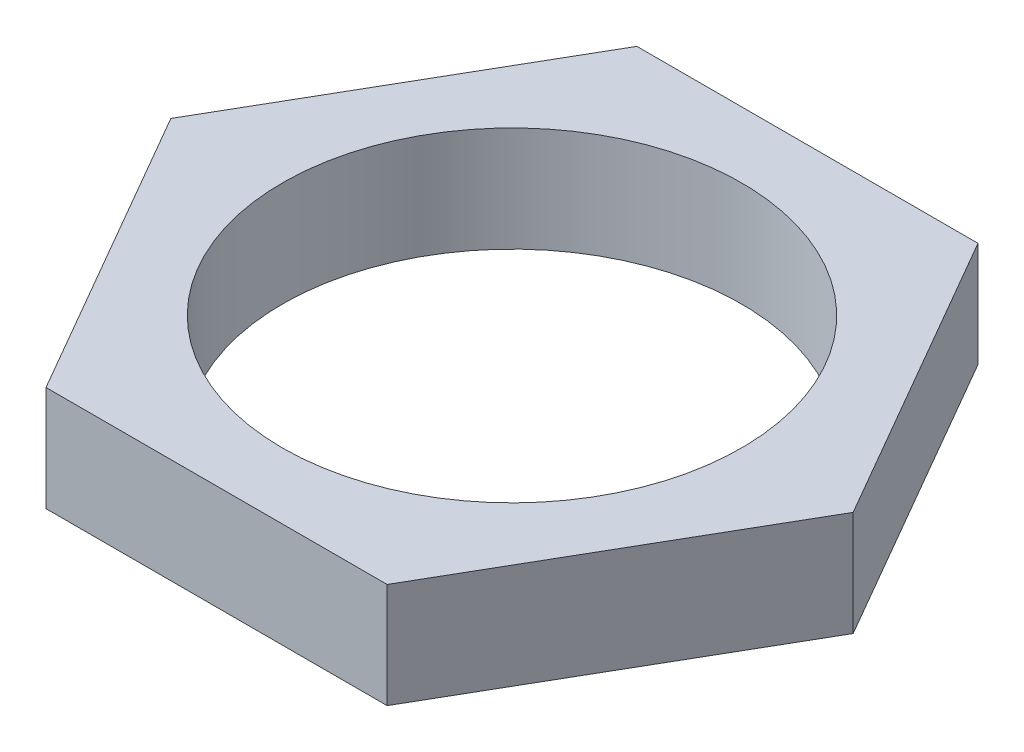
ISO-10303-21;
HEADER;
FILE_DESCRIPTION(('STEP AP214'),'2;1');
FILE_NAME('part.step','',(''),(''),'','','');
FILE_SCHEMA(('AUTOMOTIVE_DESIGN { 1 0 10303 214 1 1 1 1 }'));
ENDSEC;
DATA;
#1=APPLICATION_CONTEXT('core data for automotive mechanical design processes');
#2=APPLICATION_PROTOCOL_DEFINITION('international standard','automotive_design',2000,#1);
#3=PRODUCT_CONTEXT('',#1,'mechanical');
#4=PRODUCT('Part','Part','',(#3));
#5=PRODUCT_RELATED_PRODUCT_CATEGORY('part','',(#4));
#6=PRODUCT_DEFINITION_FORMATION('','',#4);
#7=PRODUCT_DEFINITION_CONTEXT('part definition',#1,'design');
#8=PRODUCT_DEFINITION('design','',#6,#7);
#9=PRODUCT_DEFINITION_SHAPE('','',#8);
#10=(LENGTH_UNIT() NAMED_UNIT(*) SI_UNIT(.MILLI.,.METRE.));
#11=(NAMED_UNIT(*) PLANE_ANGLE_UNIT() SI_UNIT($,.RADIAN.));
#12=(NAMED_UNIT(*) SI_UNIT($,.STERADIAN.) SOLID_ANGLE_UNIT());
#13=UNCERTAINTY_MEASURE_WITH_UNIT(LENGTH_MEASURE(1.E-05),#10,'distance_accuracy_value','');
#14=(GEOMETRIC_REPRESENTATION_CONTEXT(3) GLOBAL_UNCERTAINTY_ASSIGNED_CONTEXT((#13)) GLOBAL_UNIT_ASSIGNED_CONTEXT((#10,
#11,#12)) REPRESENTATION_CONTEXT('',''));
#15=CARTESIAN_POINT('',(0.,0.,0.));
#16=DIRECTION('',(0.,0.,1.));
#17=DIRECTION('',(1.,0.,0.));
#18=AXIS2_PLACEMENT_3D('',#15,#16,#17);
#19=CARTESIAN_POINT('',(0.,2.54,0.));
#20=DIRECTION('',(0.,1.,0.));
#21=DIRECTION('',(0.,0.,1.));
#22=AXIS2_PLACEMENT_3D('',#19,#20,#21);
#23=PLANE('',#22);
#24=DIRECTION('',(1.,0.,0.));
#25=VECTOR('',#24,1.);
#26=CARTESIAN_POINT('',(-4.1275,2.54,7.14903970824054));
#27=LINE('',#26,#25);
#28=CARTESIAN_POINT('',(-4.1275,2.54,7.14903970824054));
#29=VERTEX_POINT('',#28);
#30=CARTESIAN_POINT('',(4.1275,2.54,7.14903970824054));
#31=VERTEX_POINT('',#30);
#32=EDGE_CURVE('E129',#29,#31,#27,.T.);
#33=ORIENTED_EDGE('',*,*,#32,.T.);
#34=DIRECTION('',(0.5,0.,-0.866025403784439));
#35=VECTOR('',#34,1.);
#36=CARTESIAN_POINT('',(4.1275,2.54,7.14903970824054));
#37=LINE('',#36,#35);
#38=CARTESIAN_POINT('',(8.255,2.54,0.));
#39=VERTEX_POINT('',#38);
#40=EDGE_CURVE('E87',#31,#39,#37,.T.);
#41=ORIENTED_EDGE('',*,*,#40,.T.);
#42=DIRECTION('',(-0.5,0.,-0.866025403784438));
#43=VECTOR('',#42,1.);
#44=CARTESIAN_POINT('',(8.255,2.54,0.));
#45=LINE('',#44,#43);
#46=CARTESIAN_POINT('',(4.1275,2.54,-7.14903970824054));
#47=VERTEX_POINT('',#46);
#48=EDGE_CURVE('E100',#39,#47,#45,.T.);
#49=ORIENTED_EDGE('',*,*,#48,.T.);
#50=DIRECTION('',(-1.,0.,0.));
#51=VECTOR('',#50,1.);
#52=CARTESIAN_POINT('',(4.1275,2.54,-7.14903970824054));
#53=LINE('',#52,#51);
#54=CARTESIAN_POINT('',(-4.1275,2.54,-7.14903970824054));
#55=VERTEX_POINT('',#54);
#56=EDGE_CURVE('E94',#47,#55,#53,.T.);
#57=ORIENTED_EDGE('',*,*,#56,.T.);
#58=DIRECTION('',(-0.5,0.,0.866025403784439));
#59=VECTOR('',#58,1.);
#60=CARTESIAN_POINT('',(-4.1275,2.54,-7.14903970824054));
#61=LINE('',#60,#59);
#62=CARTESIAN_POINT('',(-8.255,2.54,0.));
#63=VERTEX_POINT('',#62);
#64=EDGE_CURVE('E98',#55,#63,#61,.T.);
#65=ORIENTED_EDGE('',*,*,#64,.T.);
#66=DIRECTION('',(0.5,0.,0.866025403784439));
#67=VECTOR('',#66,1.);
#68=CARTESIAN_POINT('',(-8.255,2.54,0.));
#69=LINE('',#68,#67);
#70=EDGE_CURVE('E50',#63,#29,#69,.T.);
#71=ORIENTED_EDGE('',*,*,#70,.T.);
#72=EDGE_LOOP('',(#33,#41,#49,#57,#65,#71));
#73=FACE_BOUND('',#72,.T.);
#74=CARTESIAN_POINT('',(0.,2.54,0.));
#75=DIRECTION('',(0.,1.,0.));
#76=DIRECTION('',(0.,0.,1.));
#77=AXIS2_PLACEMENT_3D('',#74,#75,#76);
#78=CIRCLE('',#77,5.55625);
#79=CARTESIAN_POINT('',(0.,2.54,5.55625));
#80=VERTEX_POINT('',#79);
#81=EDGE_CURVE('E122',#80,#80,#78,.T.);
#82=ORIENTED_EDGE('',*,*,#81,.F.);
#83=EDGE_LOOP('',(#82));
#84=FACE_BOUND('',#83,.T.);
#85=ADVANCED_FACE('F33',(#73,#84),#23,.T.);
#86=CARTESIAN_POINT('',(0.,0.,0.));
#87=DIRECTION('',(0.,1.,0.));
#88=DIRECTION('',(0.,0.,1.));
#89=AXIS2_PLACEMENT_3D('',#86,#87,#88);
#90=PLANE('',#89);
#91=DIRECTION('',(1.,0.,0.));
#92=VECTOR('',#91,1.);
#93=CARTESIAN_POINT('',(-4.1275,0.,7.14903970824054));
#94=LINE('',#93,#92);
#95=CARTESIAN_POINT('',(-4.1275,0.,7.14903970824054));
#96=VERTEX_POINT('',#95);
#97=CARTESIAN_POINT('',(4.1275,0.,7.14903970824054));
#98=VERTEX_POINT('',#97);
#99=EDGE_CURVE('E118',#96,#98,#94,.T.);
#100=ORIENTED_EDGE('',*,*,#99,.F.);
#101=DIRECTION('',(0.5,0.,0.866025403784439));
#102=VECTOR('',#101,1.);
#103=CARTESIAN_POINT('',(-8.255,0.,0.));
#104=LINE('',#103,#102);
#105=CARTESIAN_POINT('',(-8.255,0.,0.));
#106=VERTEX_POINT('',#105);
#107=EDGE_CURVE('E79',#106,#96,#104,.T.);
#108=ORIENTED_EDGE('',*,*,#107,.F.);
#109=DIRECTION('',(-0.5,0.,0.866025403784439));
#110=VECTOR('',#109,1.);
#111=CARTESIAN_POINT('',(-4.1275,0.,-7.14903970824054));
#112=LINE('',#111,#110);
#113=CARTESIAN_POINT('',(-4.1275,0.,-7.14903970824054));
#114=VERTEX_POINT('',#113);
#115=EDGE_CURVE('E73',#114,#106,#112,.T.);
#116=ORIENTED_EDGE('',*,*,#115,.F.);
#117=DIRECTION('',(-1.,0.,0.));
#118=VECTOR('',#117,1.);
#119=CARTESIAN_POINT('',(4.1275,0.,-7.14903970824054));
#120=LINE('',#119,#118);
#121=CARTESIAN_POINT('',(4.1275,0.,-7.14903970824054));
#122=VERTEX_POINT('',#121);
#123=EDGE_CURVE('E108',#122,#114,#120,.T.);
#124=ORIENTED_EDGE('',*,*,#123,.F.);
#125=DIRECTION('',(-0.5,0.,-0.866025403784438));
#126=VECTOR('',#125,1.);
#127=CARTESIAN_POINT('',(8.255,0.,0.));
#128=LINE('',#127,#126);
#129=CARTESIAN_POINT('',(8.255,0.,0.));
#130=VERTEX_POINT('',#129);
#131=EDGE_CURVE('E124',#130,#122,#128,.T.);
#132=ORIENTED_EDGE('',*,*,#131,.F.);
#133=DIRECTION('',(0.5,0.,-0.866025403784439));
#134=VECTOR('',#133,1.);
#135=CARTESIAN_POINT('',(4.1275,0.,7.14903970824054));
#136=LINE('',#135,#134);
#137=EDGE_CURVE('E121',#98,#130,#136,.T.);
#138=ORIENTED_EDGE('',*,*,#137,.F.);
#139=EDGE_LOOP('',(#100,#108,#116,#124,#132,#138));
#140=FACE_BOUND('',#139,.T.);
#141=CARTESIAN_POINT('',(0.,0.,0.));
#142=DIRECTION('',(0.,1.,0.));
#143=DIRECTION('',(0.,0.,1.));
#144=AXIS2_PLACEMENT_3D('',#141,#142,#143);
#145=CIRCLE('',#144,5.55625);
#146=CARTESIAN_POINT('',(0.,0.,5.55625));
#147=VERTEX_POINT('',#146);
#148=EDGE_CURVE('E222',#147,#147,#145,.T.);
#149=ORIENTED_EDGE('',*,*,#148,.T.);
#150=EDGE_LOOP('',(#149));
#151=FACE_BOUND('',#150,.T.);
#152=ADVANCED_FACE('F138',(#140,#151),#90,.F.);
#153=CARTESIAN_POINT('',(-4.1275,2.54,7.14903970824054));
#154=DIRECTION('',(0.,0.,-1.));
#155=DIRECTION('',(-1.,0.,0.));
#156=AXIS2_PLACEMENT_3D('',#153,#154,#155);
#157=PLANE('',#156);
#158=ORIENTED_EDGE('',*,*,#99,.T.);
#159=DIRECTION('',(0.,-1.,0.));
#160=VECTOR('',#159,1.);
#161=CARTESIAN_POINT('',(4.1275,2.54,7.14903970824054));
#162=LINE('',#161,#160);
#163=EDGE_CURVE('E11',#31,#98,#162,.T.);
#164=ORIENTED_EDGE('',*,*,#163,.F.);
#165=ORIENTED_EDGE('',*,*,#32,.F.);
#166=DIRECTION('',(0.,-1.,0.));
#167=VECTOR('',#166,1.);
#168=CARTESIAN_POINT('',(-4.1275,2.54,7.14903970824054));
#169=LINE('',#168,#167);
#170=EDGE_CURVE('E114',#29,#96,#169,.T.);
#171=ORIENTED_EDGE('',*,*,#170,.T.);
#172=EDGE_LOOP('',(#158,#164,#165,#171));
#173=FACE_BOUND('',#172,.T.);
#174=ADVANCED_FACE('F35',(#173),#157,.F.);
#175=CARTESIAN_POINT('',(4.1275,2.54,7.14903970824054));
#176=DIRECTION('',(-0.866025403784439,0.,-0.5));
#177=DIRECTION('',(-0.5,0.,0.866025403784439));
#178=AXIS2_PLACEMENT_3D('',#175,#176,#177);
#179=PLANE('',#178);
#180=ORIENTED_EDGE('',*,*,#137,.T.);
#181=DIRECTION('',(0.,-1.,0.));
#182=VECTOR('',#181,1.);
#183=CARTESIAN_POINT('',(8.255,2.54,0.));
#184=LINE('',#183,#182);
#185=EDGE_CURVE('E42',#39,#130,#184,.T.);
#186=ORIENTED_EDGE('',*,*,#185,.F.);
#187=ORIENTED_EDGE('',*,*,#40,.F.);
#188=ORIENTED_EDGE('',*,*,#163,.T.);
#189=EDGE_LOOP('',(#180,#186,#187,#188));
#190=FACE_BOUND('',#189,.T.);
#191=ADVANCED_FACE('F163',(#190),#179,.F.);
#192=CARTESIAN_POINT('',(8.255,2.54,0.));
#193=DIRECTION('',(-0.866025403784438,0.,0.5));
#194=DIRECTION('',(0.5,0.,0.866025403784438));
#195=AXIS2_PLACEMENT_3D('',#192,#193,#194);
#196=PLANE('',#195);
#197=ORIENTED_EDGE('',*,*,#131,.T.);
#198=DIRECTION('',(0.,-1.,0.));
#199=VECTOR('',#198,1.);
#200=CARTESIAN_POINT('',(4.1275,2.54,-7.14903970824054));
#201=LINE('',#200,#199);
#202=EDGE_CURVE('E109',#47,#122,#201,.T.);
#203=ORIENTED_EDGE('',*,*,#202,.F.);
#204=ORIENTED_EDGE('',*,*,#48,.F.);
#205=ORIENTED_EDGE('',*,*,#185,.T.);
#206=EDGE_LOOP('',(#197,#203,#204,#205));
#207=FACE_BOUND('',#206,.T.);
#208=ADVANCED_FACE('F135',(#207),#196,.F.);
#209=CARTESIAN_POINT('',(4.1275,2.54,-7.14903970824054));
#210=DIRECTION('',(0.,0.,1.));
#211=DIRECTION('',(1.,0.,0.));
#212=AXIS2_PLACEMENT_3D('',#209,#210,#211);
#213=PLANE('',#212);
#214=ORIENTED_EDGE('',*,*,#123,.T.);
#215=DIRECTION('',(0.,-1.,0.));
#216=VECTOR('',#215,1.);
#217=CARTESIAN_POINT('',(-4.1275,2.54,-7.14903970824054));
#218=LINE('',#217,#216);
#219=EDGE_CURVE('E105',#55,#114,#218,.T.);
#220=ORIENTED_EDGE('',*,*,#219,.F.);
#221=ORIENTED_EDGE('',*,*,#56,.F.);
#222=ORIENTED_EDGE('',*,*,#202,.T.);
#223=EDGE_LOOP('',(#214,#220,#221,#222));
#224=FACE_BOUND('',#223,.T.);
#225=ADVANCED_FACE('F106',(#224),#213,.F.);
#226=CARTESIAN_POINT('',(-4.1275,2.54,-7.14903970824054));
#227=DIRECTION('',(0.866025403784439,0.,0.5));
#228=DIRECTION('',(0.5,0.,-0.866025403784439));
#229=AXIS2_PLACEMENT_3D('',#226,#227,#228);
#230=PLANE('',#229);
#231=ORIENTED_EDGE('',*,*,#115,.T.);
#232=DIRECTION('',(0.,-1.,0.));
#233=VECTOR('',#232,1.);
#234=CARTESIAN_POINT('',(-8.255,2.54,0.));
#235=LINE('',#234,#233);
#236=EDGE_CURVE('E110',#63,#106,#235,.T.);
#237=ORIENTED_EDGE('',*,*,#236,.F.);
#238=ORIENTED_EDGE('',*,*,#64,.F.);
#239=ORIENTED_EDGE('',*,*,#219,.T.);
#240=EDGE_LOOP('',(#231,#237,#238,#239));
#241=FACE_BOUND('',#240,.T.);
#242=ADVANCED_FACE('F112',(#241),#230,.F.);
#243=CARTESIAN_POINT('',(-8.255,2.54,0.));
#244=DIRECTION('',(0.866025403784439,0.,-0.5));
#245=DIRECTION('',(-0.5,0.,-0.866025403784439));
#246=AXIS2_PLACEMENT_3D('',#243,#244,#245);
#247=PLANE('',#246);
#248=ORIENTED_EDGE('',*,*,#107,.T.);
#249=ORIENTED_EDGE('',*,*,#170,.F.);
#250=ORIENTED_EDGE('',*,*,#70,.F.);
#251=ORIENTED_EDGE('',*,*,#236,.T.);
#252=EDGE_LOOP('',(#248,#249,#250,#251));
#253=FACE_BOUND('',#252,.T.);
#254=ADVANCED_FACE('F143',(#253),#247,.F.);
#255=CARTESIAN_POINT('',(0.,2.54,0.));
#256=DIRECTION('',(0.,-1.,0.));
#257=DIRECTION('',(0.,0.,-1.));
#258=AXIS2_PLACEMENT_3D('',#255,#256,#257);
#259=CYLINDRICAL_SURFACE('',#258,5.55625);
#260=ORIENTED_EDGE('',*,*,#81,.T.);
#261=EDGE_LOOP('',(#260));
#262=FACE_BOUND('',#261,.T.);
#263=ORIENTED_EDGE('',*,*,#148,.F.);
#264=EDGE_LOOP('',(#263));
#265=FACE_BOUND('',#264,.T.);
#266=ADVANCED_FACE('F145',(#262,#265),#259,.F.);
#267=CLOSED_SHELL('',(#85,#152,#174,#191,#208,#225,#242,#254,#266));
#268=MANIFOLD_SOLID_BREP('B2',#267);
#269=ADVANCED_BREP_SHAPE_REPRESENTATION('',(#18,#268),#14);
#270=SHAPE_DEFINITION_REPRESENTATION(#9,#269);
ENDSEC;
END-ISO-10303-21;
